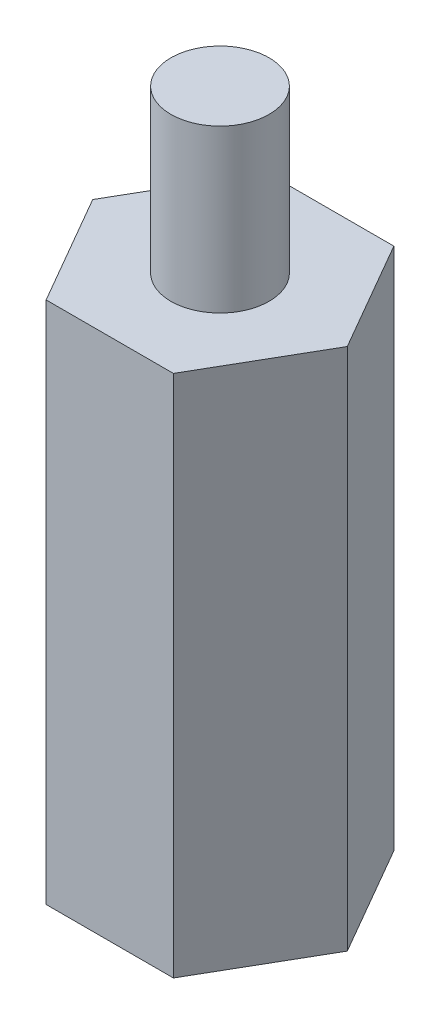
ISO-10303-21;
HEADER;
FILE_DESCRIPTION(('STEP AP214'),'2;1');
FILE_NAME('part.step','',(''),(''),'','','');
FILE_SCHEMA(('AUTOMOTIVE_DESIGN { 1 0 10303 214 1 1 1 1 }'));
ENDSEC;
DATA;
#1=APPLICATION_CONTEXT('core data for automotive mechanical design processes');
#2=APPLICATION_PROTOCOL_DEFINITION('international standard','automotive_design',2000,#1);
#3=PRODUCT_CONTEXT('',#1,'mechanical');
#4=PRODUCT('Part','Part','',(#3));
#5=PRODUCT_RELATED_PRODUCT_CATEGORY('part','',(#4));
#6=PRODUCT_DEFINITION_FORMATION('','',#4);
#7=PRODUCT_DEFINITION_CONTEXT('part definition',#1,'design');
#8=PRODUCT_DEFINITION('design','',#6,#7);
#9=PRODUCT_DEFINITION_SHAPE('','',#8);
#10=(LENGTH_UNIT() NAMED_UNIT(*) SI_UNIT(.MILLI.,.METRE.));
#11=(NAMED_UNIT(*) PLANE_ANGLE_UNIT() SI_UNIT($,.RADIAN.));
#12=(NAMED_UNIT(*) SI_UNIT($,.STERADIAN.) SOLID_ANGLE_UNIT());
#13=UNCERTAINTY_MEASURE_WITH_UNIT(LENGTH_MEASURE(1.E-05),#10,'distance_accuracy_value','');
#14=(GEOMETRIC_REPRESENTATION_CONTEXT(3) GLOBAL_UNCERTAINTY_ASSIGNED_CONTEXT((#13)) GLOBAL_UNIT_ASSIGNED_CONTEXT((#10,
#11,#12)) REPRESENTATION_CONTEXT('',''));
#15=CARTESIAN_POINT('',(0.,0.,0.));
#16=DIRECTION('',(0.,0.,1.));
#17=DIRECTION('',(1.,0.,0.));
#18=AXIS2_PLACEMENT_3D('',#15,#16,#17);
#19=CARTESIAN_POINT('',(0.,15.2,0.));
#20=DIRECTION('',(0.,1.,0.));
#21=DIRECTION('',(0.,0.,1.));
#22=AXIS2_PLACEMENT_3D('',#19,#20,#21);
#23=PLANE('',#22);
#24=DIRECTION('',(-0.5,0.,-0.866025403784439));
#25=VECTOR('',#24,1.);
#26=CARTESIAN_POINT('',(3.6950417228136,15.2,0.));
#27=LINE('',#26,#25);
#28=CARTESIAN_POINT('',(3.6950417228136,15.2,0.));
#29=VERTEX_POINT('',#28);
#30=CARTESIAN_POINT('',(1.8475208614068,15.2,-3.20000000000001));
#31=VERTEX_POINT('',#30);
#32=EDGE_CURVE('E130',#29,#31,#27,.T.);
#33=ORIENTED_EDGE('',*,*,#32,.T.);
#34=DIRECTION('',(-1.,0.,0.));
#35=VECTOR('',#34,1.);
#36=CARTESIAN_POINT('',(1.8475208614068,15.2,-3.20000000000001));
#37=LINE('',#36,#35);
#38=CARTESIAN_POINT('',(-1.8475208614068,15.2,-3.20000000000001));
#39=VERTEX_POINT('',#38);
#40=EDGE_CURVE('E88',#31,#39,#37,.T.);
#41=ORIENTED_EDGE('',*,*,#40,.T.);
#42=DIRECTION('',(-0.5,0.,0.866025403784439));
#43=VECTOR('',#42,1.);
#44=CARTESIAN_POINT('',(-1.8475208614068,15.2,-3.20000000000001));
#45=LINE('',#44,#43);
#46=CARTESIAN_POINT('',(-3.69504172281361,15.2,0.));
#47=VERTEX_POINT('',#46);
#48=EDGE_CURVE('E101',#39,#47,#45,.T.);
#49=ORIENTED_EDGE('',*,*,#48,.T.);
#50=DIRECTION('',(0.5,0.,0.866025403784439));
#51=VECTOR('',#50,1.);
#52=CARTESIAN_POINT('',(-3.69504172281361,15.2,0.));
#53=LINE('',#52,#51);
#54=CARTESIAN_POINT('',(-1.84752086140681,15.2,3.2));
#55=VERTEX_POINT('',#54);
#56=EDGE_CURVE('E95',#47,#55,#53,.T.);
#57=ORIENTED_EDGE('',*,*,#56,.T.);
#58=DIRECTION('',(1.,0.,0.));
#59=VECTOR('',#58,1.);
#60=CARTESIAN_POINT('',(-1.84752086140681,15.2,3.2));
#61=LINE('',#60,#59);
#62=CARTESIAN_POINT('',(1.8475208614068,15.2,3.2));
#63=VERTEX_POINT('',#62);
#64=EDGE_CURVE('E99',#55,#63,#61,.T.);
#65=ORIENTED_EDGE('',*,*,#64,.T.);
#66=DIRECTION('',(0.5,0.,-0.866025403784439));
#67=VECTOR('',#66,1.);
#68=CARTESIAN_POINT('',(1.8475208614068,15.2,3.2));
#69=LINE('',#68,#67);
#70=EDGE_CURVE('E51',#63,#29,#69,.T.);
#71=ORIENTED_EDGE('',*,*,#70,.T.);
#72=EDGE_LOOP('',(#33,#41,#49,#57,#65,#71));
#73=FACE_BOUND('',#72,.T.);
#74=CARTESIAN_POINT('',(0.,15.2,0.));
#75=DIRECTION('',(0.,1.,0.));
#76=DIRECTION('',(0.,0.,1.));
#77=AXIS2_PLACEMENT_3D('',#74,#75,#76);
#78=CIRCLE('',#77,1.425);
#79=CARTESIAN_POINT('',(0.,15.2,1.425));
#80=VERTEX_POINT('',#79);
#81=EDGE_CURVE('E180',#80,#80,#78,.T.);
#82=ORIENTED_EDGE('',*,*,#81,.F.);
#83=EDGE_LOOP('',(#82));
#84=FACE_BOUND('',#83,.T.);
#85=ADVANCED_FACE('F34',(#73,#84),#23,.T.);
#86=CARTESIAN_POINT('',(3.6950417228136,15.2,0.));
#87=DIRECTION('',(-0.866025403784439,0.,0.5));
#88=DIRECTION('',(0.5,0.,0.866025403784439));
#89=AXIS2_PLACEMENT_3D('',#86,#87,#88);
#90=PLANE('',#89);
#91=DIRECTION('',(-0.5,0.,-0.866025403784439));
#92=VECTOR('',#91,1.);
#93=CARTESIAN_POINT('',(3.6950417228136,0.,0.));
#94=LINE('',#93,#92);
#95=CARTESIAN_POINT('',(3.6950417228136,0.,0.));
#96=VERTEX_POINT('',#95);
#97=CARTESIAN_POINT('',(1.8475208614068,0.,-3.20000000000001));
#98=VERTEX_POINT('',#97);
#99=EDGE_CURVE('E119',#96,#98,#94,.T.);
#100=ORIENTED_EDGE('',*,*,#99,.T.);
#101=DIRECTION('',(0.,-1.,0.));
#102=VECTOR('',#101,1.);
#103=CARTESIAN_POINT('',(1.8475208614068,15.2,-3.20000000000001));
#104=LINE('',#103,#102);
#105=EDGE_CURVE('E11',#31,#98,#104,.T.);
#106=ORIENTED_EDGE('',*,*,#105,.F.);
#107=ORIENTED_EDGE('',*,*,#32,.F.);
#108=DIRECTION('',(0.,-1.,0.));
#109=VECTOR('',#108,1.);
#110=CARTESIAN_POINT('',(3.6950417228136,15.2,0.));
#111=LINE('',#110,#109);
#112=EDGE_CURVE('E115',#29,#96,#111,.T.);
#113=ORIENTED_EDGE('',*,*,#112,.T.);
#114=EDGE_LOOP('',(#100,#106,#107,#113));
#115=FACE_BOUND('',#114,.T.);
#116=ADVANCED_FACE('F36',(#115),#90,.F.);
#117=CARTESIAN_POINT('',(1.8475208614068,15.2,-3.20000000000001));
#118=DIRECTION('',(0.,0.,1.));
#119=DIRECTION('',(1.,0.,0.));
#120=AXIS2_PLACEMENT_3D('',#117,#118,#119);
#121=PLANE('',#120);
#122=DIRECTION('',(-1.,0.,0.));
#123=VECTOR('',#122,1.);
#124=CARTESIAN_POINT('',(1.8475208614068,0.,-3.20000000000001));
#125=LINE('',#124,#123);
#126=CARTESIAN_POINT('',(-1.8475208614068,0.,-3.20000000000001));
#127=VERTEX_POINT('',#126);
#128=EDGE_CURVE('E122',#98,#127,#125,.T.);
#129=ORIENTED_EDGE('',*,*,#128,.T.);
#130=DIRECTION('',(0.,-1.,0.));
#131=VECTOR('',#130,1.);
#132=CARTESIAN_POINT('',(-1.8475208614068,15.2,-3.20000000000001));
#133=LINE('',#132,#131);
#134=EDGE_CURVE('E43',#39,#127,#133,.T.);
#135=ORIENTED_EDGE('',*,*,#134,.F.);
#136=ORIENTED_EDGE('',*,*,#40,.F.);
#137=ORIENTED_EDGE('',*,*,#105,.T.);
#138=EDGE_LOOP('',(#129,#135,#136,#137));
#139=FACE_BOUND('',#138,.T.);
#140=ADVANCED_FACE('F159',(#139),#121,.F.);
#141=CARTESIAN_POINT('',(-1.8475208614068,15.2,-3.20000000000001));
#142=DIRECTION('',(0.866025403784439,0.,0.5));
#143=DIRECTION('',(0.5,0.,-0.866025403784439));
#144=AXIS2_PLACEMENT_3D('',#141,#142,#143);
#145=PLANE('',#144);
#146=DIRECTION('',(-0.5,0.,0.866025403784439));
#147=VECTOR('',#146,1.);
#148=CARTESIAN_POINT('',(-1.8475208614068,0.,-3.20000000000001));
#149=LINE('',#148,#147);
#150=CARTESIAN_POINT('',(-3.69504172281361,0.,0.));
#151=VERTEX_POINT('',#150);
#152=EDGE_CURVE('E125',#127,#151,#149,.T.);
#153=ORIENTED_EDGE('',*,*,#152,.T.);
#154=DIRECTION('',(0.,-1.,0.));
#155=VECTOR('',#154,1.);
#156=CARTESIAN_POINT('',(-3.69504172281361,15.2,0.));
#157=LINE('',#156,#155);
#158=EDGE_CURVE('E110',#47,#151,#157,.T.);
#159=ORIENTED_EDGE('',*,*,#158,.F.);
#160=ORIENTED_EDGE('',*,*,#48,.F.);
#161=ORIENTED_EDGE('',*,*,#134,.T.);
#162=EDGE_LOOP('',(#153,#159,#160,#161));
#163=FACE_BOUND('',#162,.T.);
#164=ADVANCED_FACE('F136',(#163),#145,.F.);
#165=CARTESIAN_POINT('',(-3.69504172281361,15.2,0.));
#166=DIRECTION('',(0.866025403784439,0.,-0.5));
#167=DIRECTION('',(-0.5,0.,-0.866025403784439));
#168=AXIS2_PLACEMENT_3D('',#165,#166,#167);
#169=PLANE('',#168);
#170=DIRECTION('',(0.5,0.,0.866025403784439));
#171=VECTOR('',#170,1.);
#172=CARTESIAN_POINT('',(-3.69504172281361,0.,0.));
#173=LINE('',#172,#171);
#174=CARTESIAN_POINT('',(-1.84752086140681,0.,3.2));
#175=VERTEX_POINT('',#174);
#176=EDGE_CURVE('E109',#151,#175,#173,.T.);
#177=ORIENTED_EDGE('',*,*,#176,.T.);
#178=DIRECTION('',(0.,-1.,0.));
#179=VECTOR('',#178,1.);
#180=CARTESIAN_POINT('',(-1.84752086140681,15.2,3.2));
#181=LINE('',#180,#179);
#182=EDGE_CURVE('E106',#55,#175,#181,.T.);
#183=ORIENTED_EDGE('',*,*,#182,.F.);
#184=ORIENTED_EDGE('',*,*,#56,.F.);
#185=ORIENTED_EDGE('',*,*,#158,.T.);
#186=EDGE_LOOP('',(#177,#183,#184,#185));
#187=FACE_BOUND('',#186,.T.);
#188=ADVANCED_FACE('F107',(#187),#169,.F.);
#189=CARTESIAN_POINT('',(-1.84752086140681,15.2,3.2));
#190=DIRECTION('',(0.,0.,-1.));
#191=DIRECTION('',(-1.,0.,0.));
#192=AXIS2_PLACEMENT_3D('',#189,#190,#191);
#193=PLANE('',#192);
#194=DIRECTION('',(1.,0.,0.));
#195=VECTOR('',#194,1.);
#196=CARTESIAN_POINT('',(-1.84752086140681,0.,3.2));
#197=LINE('',#196,#195);
#198=CARTESIAN_POINT('',(1.8475208614068,0.,3.2));
#199=VERTEX_POINT('',#198);
#200=EDGE_CURVE('E74',#175,#199,#197,.T.);
#201=ORIENTED_EDGE('',*,*,#200,.T.);
#202=DIRECTION('',(0.,-1.,0.));
#203=VECTOR('',#202,1.);
#204=CARTESIAN_POINT('',(1.8475208614068,15.2,3.2));
#205=LINE('',#204,#203);
#206=EDGE_CURVE('E111',#63,#199,#205,.T.);
#207=ORIENTED_EDGE('',*,*,#206,.F.);
#208=ORIENTED_EDGE('',*,*,#64,.F.);
#209=ORIENTED_EDGE('',*,*,#182,.T.);
#210=EDGE_LOOP('',(#201,#207,#208,#209));
#211=FACE_BOUND('',#210,.T.);
#212=ADVANCED_FACE('F113',(#211),#193,.F.);
#213=CARTESIAN_POINT('',(1.8475208614068,15.2,3.2));
#214=DIRECTION('',(-0.866025403784439,0.,-0.5));
#215=DIRECTION('',(-0.5,0.,0.866025403784439));
#216=AXIS2_PLACEMENT_3D('',#213,#214,#215);
#217=PLANE('',#216);
#218=DIRECTION('',(0.5,0.,-0.866025403784439));
#219=VECTOR('',#218,1.);
#220=CARTESIAN_POINT('',(1.8475208614068,0.,3.2));
#221=LINE('',#220,#219);
#222=EDGE_CURVE('E80',#199,#96,#221,.T.);
#223=ORIENTED_EDGE('',*,*,#222,.T.);
#224=ORIENTED_EDGE('',*,*,#112,.F.);
#225=ORIENTED_EDGE('',*,*,#70,.F.);
#226=ORIENTED_EDGE('',*,*,#206,.T.);
#227=EDGE_LOOP('',(#223,#224,#225,#226));
#228=FACE_BOUND('',#227,.T.);
#229=ADVANCED_FACE('F143',(#228),#217,.F.);
#230=CARTESIAN_POINT('',(0.,0.,0.));
#231=DIRECTION('',(0.,1.,0.));
#232=DIRECTION('',(0.,0.,1.));
#233=AXIS2_PLACEMENT_3D('',#230,#231,#232);
#234=PLANE('',#233);
#235=CARTESIAN_POINT('',(0.,0.,0.));
#236=DIRECTION('',(0.,-1.,0.));
#237=DIRECTION('',(0.,0.,-1.));
#238=AXIS2_PLACEMENT_3D('',#235,#236,#237);
#239=CIRCLE('',#238,1.425);
#240=CARTESIAN_POINT('',(0.,0.,-1.425));
#241=VERTEX_POINT('',#240);
#242=EDGE_CURVE('E181',#241,#241,#239,.T.);
#243=ORIENTED_EDGE('',*,*,#242,.F.);
#244=EDGE_LOOP('',(#243));
#245=FACE_BOUND('',#244,.T.);
#246=ORIENTED_EDGE('',*,*,#99,.F.);
#247=ORIENTED_EDGE('',*,*,#222,.F.);
#248=ORIENTED_EDGE('',*,*,#200,.F.);
#249=ORIENTED_EDGE('',*,*,#176,.F.);
#250=ORIENTED_EDGE('',*,*,#152,.F.);
#251=ORIENTED_EDGE('',*,*,#128,.F.);
#252=EDGE_LOOP('',(#246,#247,#248,#249,#250,#251));
#253=FACE_BOUND('',#252,.T.);
#254=ADVANCED_FACE('F139',(#245,#253),#234,.F.);
#255=CARTESIAN_POINT('',(0.,19.9,0.));
#256=DIRECTION('',(0.,-1.,0.));
#257=DIRECTION('',(0.,0.,-1.));
#258=AXIS2_PLACEMENT_3D('',#255,#256,#257);
#259=CYLINDRICAL_SURFACE('',#258,1.425);
#260=CARTESIAN_POINT('',(0.,19.9,0.));
#261=DIRECTION('',(0.,1.,0.));
#262=DIRECTION('',(0.,0.,1.));
#263=AXIS2_PLACEMENT_3D('',#260,#261,#262);
#264=CIRCLE('',#263,1.425);
#265=CARTESIAN_POINT('',(0.,19.9,1.425));
#266=VERTEX_POINT('',#265);
#267=EDGE_CURVE('E123',#266,#266,#264,.T.);
#268=ORIENTED_EDGE('',*,*,#267,.F.);
#269=EDGE_LOOP('',(#268));
#270=FACE_BOUND('',#269,.T.);
#271=ORIENTED_EDGE('',*,*,#81,.T.);
#272=EDGE_LOOP('',(#271));
#273=FACE_BOUND('',#272,.T.);
#274=ADVANCED_FACE('F150',(#270,#273),#259,.T.);
#275=CARTESIAN_POINT('',(0.,19.9,0.));
#276=DIRECTION('',(0.,1.,0.));
#277=DIRECTION('',(0.,0.,1.));
#278=AXIS2_PLACEMENT_3D('',#275,#276,#277);
#279=PLANE('',#278);
#280=ORIENTED_EDGE('',*,*,#267,.T.);
#281=EDGE_LOOP('',(#280));
#282=FACE_BOUND('',#281,.T.);
#283=ADVANCED_FACE('F163',(#282),#279,.T.);
#284=CARTESIAN_POINT('',(0.,4.,0.));
#285=DIRECTION('',(0.,-1.,0.));
#286=DIRECTION('',(0.,0.,-1.));
#287=AXIS2_PLACEMENT_3D('',#284,#285,#286);
#288=CYLINDRICAL_SURFACE('',#287,1.425);
#289=CARTESIAN_POINT('',(0.,4.,0.));
#290=DIRECTION('',(0.,-1.,0.));
#291=DIRECTION('',(0.,0.,-1.));
#292=AXIS2_PLACEMENT_3D('',#289,#290,#291);
#293=CIRCLE('',#292,1.425);
#294=CARTESIAN_POINT('',(0.,4.,-1.425));
#295=VERTEX_POINT('',#294);
#296=EDGE_CURVE('E179',#295,#295,#293,.T.);
#297=ORIENTED_EDGE('',*,*,#296,.F.);
#298=EDGE_LOOP('',(#297));
#299=FACE_BOUND('',#298,.T.);
#300=ORIENTED_EDGE('',*,*,#242,.T.);
#301=EDGE_LOOP('',(#300));
#302=FACE_BOUND('',#301,.T.);
#303=ADVANCED_FACE('F167',(#299,#302),#288,.F.);
#304=CARTESIAN_POINT('',(0.,4.,0.));
#305=DIRECTION('',(0.,-1.,0.));
#306=DIRECTION('',(0.,0.,-1.));
#307=AXIS2_PLACEMENT_3D('',#304,#305,#306);
#308=PLANE('',#307);
#309=ORIENTED_EDGE('',*,*,#296,.T.);
#310=EDGE_LOOP('',(#309));
#311=FACE_BOUND('',#310,.T.);
#312=ADVANCED_FACE('F171',(#311),#308,.T.);
#313=CLOSED_SHELL('',(#85,#116,#140,#164,#188,#212,#229,#254,#274,#283,#303,#312));
#314=MANIFOLD_SOLID_BREP('B2',#313);
#315=ADVANCED_BREP_SHAPE_REPRESENTATION('',(#18,#314),#14);
#316=SHAPE_DEFINITION_REPRESENTATION(#9,#315);
ENDSEC;
END-ISO-10303-21;
